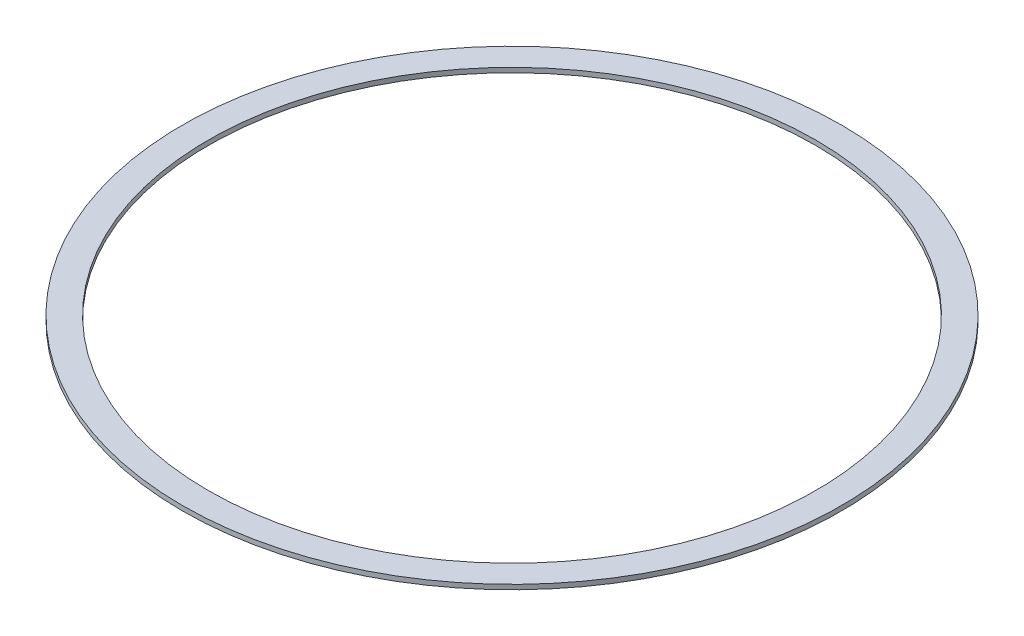
ISO-10303-21;
HEADER;
FILE_DESCRIPTION(('STEP AP214'),'2;1');
FILE_NAME('part.step','',(''),(''),'','','');
FILE_SCHEMA(('AUTOMOTIVE_DESIGN { 1 0 10303 214 1 1 1 1 }'));
ENDSEC;
DATA;
#1=APPLICATION_CONTEXT('core data for automotive mechanical design processes');
#2=APPLICATION_PROTOCOL_DEFINITION('international standard','automotive_design',2000,#1);
#3=PRODUCT_CONTEXT('',#1,'mechanical');
#4=PRODUCT('Part','Part','',(#3));
#5=PRODUCT_RELATED_PRODUCT_CATEGORY('part','',(#4));
#6=PRODUCT_DEFINITION_FORMATION('','',#4);
#7=PRODUCT_DEFINITION_CONTEXT('part definition',#1,'design');
#8=PRODUCT_DEFINITION('design','',#6,#7);
#9=PRODUCT_DEFINITION_SHAPE('','',#8);
#10=(LENGTH_UNIT() NAMED_UNIT(*) SI_UNIT(.MILLI.,.METRE.));
#11=(NAMED_UNIT(*) PLANE_ANGLE_UNIT() SI_UNIT($,.RADIAN.));
#12=(NAMED_UNIT(*) SI_UNIT($,.STERADIAN.) SOLID_ANGLE_UNIT());
#13=UNCERTAINTY_MEASURE_WITH_UNIT(LENGTH_MEASURE(1.E-05),#10,'distance_accuracy_value','');
#14=(GEOMETRIC_REPRESENTATION_CONTEXT(3) GLOBAL_UNCERTAINTY_ASSIGNED_CONTEXT((#13)) GLOBAL_UNIT_ASSIGNED_CONTEXT((#10,
#11,#12)) REPRESENTATION_CONTEXT('',''));
#15=CARTESIAN_POINT('',(0.,0.,0.));
#16=DIRECTION('',(0.,0.,1.));
#17=DIRECTION('',(1.,0.,0.));
#18=AXIS2_PLACEMENT_3D('',#15,#16,#17);
#19=CARTESIAN_POINT('',(0.,0.5,0.));
#20=DIRECTION('',(0.,1.,0.));
#21=DIRECTION('',(0.,0.,1.));
#22=AXIS2_PLACEMENT_3D('',#19,#20,#21);
#23=PLANE('',#22);
#24=CARTESIAN_POINT('',(0.,0.5,0.));
#25=DIRECTION('',(0.,1.,0.));
#26=DIRECTION('',(0.,0.,1.));
#27=AXIS2_PLACEMENT_3D('',#24,#25,#26);
#28=CIRCLE('',#27,35.);
#29=CARTESIAN_POINT('',(0.,0.5,35.));
#30=VERTEX_POINT('',#29);
#31=EDGE_CURVE('E10',#30,#30,#28,.T.);
#32=ORIENTED_EDGE('',*,*,#31,.T.);
#33=EDGE_LOOP('',(#32));
#34=FACE_BOUND('',#33,.T.);
#35=CARTESIAN_POINT('',(0.,0.5,0.));
#36=DIRECTION('',(0.,1.,0.));
#37=DIRECTION('',(0.,0.,1.));
#38=AXIS2_PLACEMENT_3D('',#35,#36,#37);
#39=CIRCLE('',#38,32.25);
#40=CARTESIAN_POINT('',(0.,0.5,32.25));
#41=VERTEX_POINT('',#40);
#42=EDGE_CURVE('E48',#41,#41,#39,.T.);
#43=ORIENTED_EDGE('',*,*,#42,.F.);
#44=EDGE_LOOP('',(#43));
#45=FACE_BOUND('',#44,.T.);
#46=ADVANCED_FACE('F37',(#34,#45),#23,.T.);
#47=CARTESIAN_POINT('',(0.,0.,0.));
#48=DIRECTION('',(0.,1.,0.));
#49=DIRECTION('',(0.,0.,1.));
#50=AXIS2_PLACEMENT_3D('',#47,#48,#49);
#51=PLANE('',#50);
#52=CARTESIAN_POINT('',(0.,0.,0.));
#53=DIRECTION('',(0.,1.,0.));
#54=DIRECTION('',(0.,0.,1.));
#55=AXIS2_PLACEMENT_3D('',#52,#53,#54);
#56=CIRCLE('',#55,35.);
#57=CARTESIAN_POINT('',(0.,0.,35.));
#58=VERTEX_POINT('',#57);
#59=EDGE_CURVE('E41',#58,#58,#56,.T.);
#60=ORIENTED_EDGE('',*,*,#59,.F.);
#61=EDGE_LOOP('',(#60));
#62=FACE_BOUND('',#61,.T.);
#63=CARTESIAN_POINT('',(0.,0.,0.));
#64=DIRECTION('',(0.,1.,0.));
#65=DIRECTION('',(0.,0.,1.));
#66=AXIS2_PLACEMENT_3D('',#63,#64,#65);
#67=CIRCLE('',#66,32.25);
#68=CARTESIAN_POINT('',(0.,0.,32.25));
#69=VERTEX_POINT('',#68);
#70=EDGE_CURVE('E50',#69,#69,#67,.T.);
#71=ORIENTED_EDGE('',*,*,#70,.T.);
#72=EDGE_LOOP('',(#71));
#73=FACE_BOUND('',#72,.T.);
#74=ADVANCED_FACE('F60',(#62,#73),#51,.F.);
#75=CARTESIAN_POINT('',(0.,0.5,0.));
#76=DIRECTION('',(0.,-1.,0.));
#77=DIRECTION('',(0.,0.,-1.));
#78=AXIS2_PLACEMENT_3D('',#75,#76,#77);
#79=CYLINDRICAL_SURFACE('',#78,35.);
#80=ORIENTED_EDGE('',*,*,#31,.F.);
#81=EDGE_LOOP('',(#80));
#82=FACE_BOUND('',#81,.T.);
#83=ORIENTED_EDGE('',*,*,#59,.T.);
#84=EDGE_LOOP('',(#83));
#85=FACE_BOUND('',#84,.T.);
#86=ADVANCED_FACE('F39',(#82,#85),#79,.T.);
#87=CARTESIAN_POINT('',(0.,0.5,0.));
#88=DIRECTION('',(0.,-1.,0.));
#89=DIRECTION('',(0.,0.,-1.));
#90=AXIS2_PLACEMENT_3D('',#87,#88,#89);
#91=CYLINDRICAL_SURFACE('',#90,32.25);
#92=ORIENTED_EDGE('',*,*,#42,.T.);
#93=EDGE_LOOP('',(#92));
#94=FACE_BOUND('',#93,.T.);
#95=ORIENTED_EDGE('',*,*,#70,.F.);
#96=EDGE_LOOP('',(#95));
#97=FACE_BOUND('',#96,.T.);
#98=ADVANCED_FACE('F56',(#94,#97),#91,.F.);
#99=CLOSED_SHELL('',(#46,#74,#86,#98));
#100=MANIFOLD_SOLID_BREP('B2',#99);
#101=ADVANCED_BREP_SHAPE_REPRESENTATION('',(#18,#100),#14);
#102=SHAPE_DEFINITION_REPRESENTATION(#9,#101);
ENDSEC;
END-ISO-10303-21;
